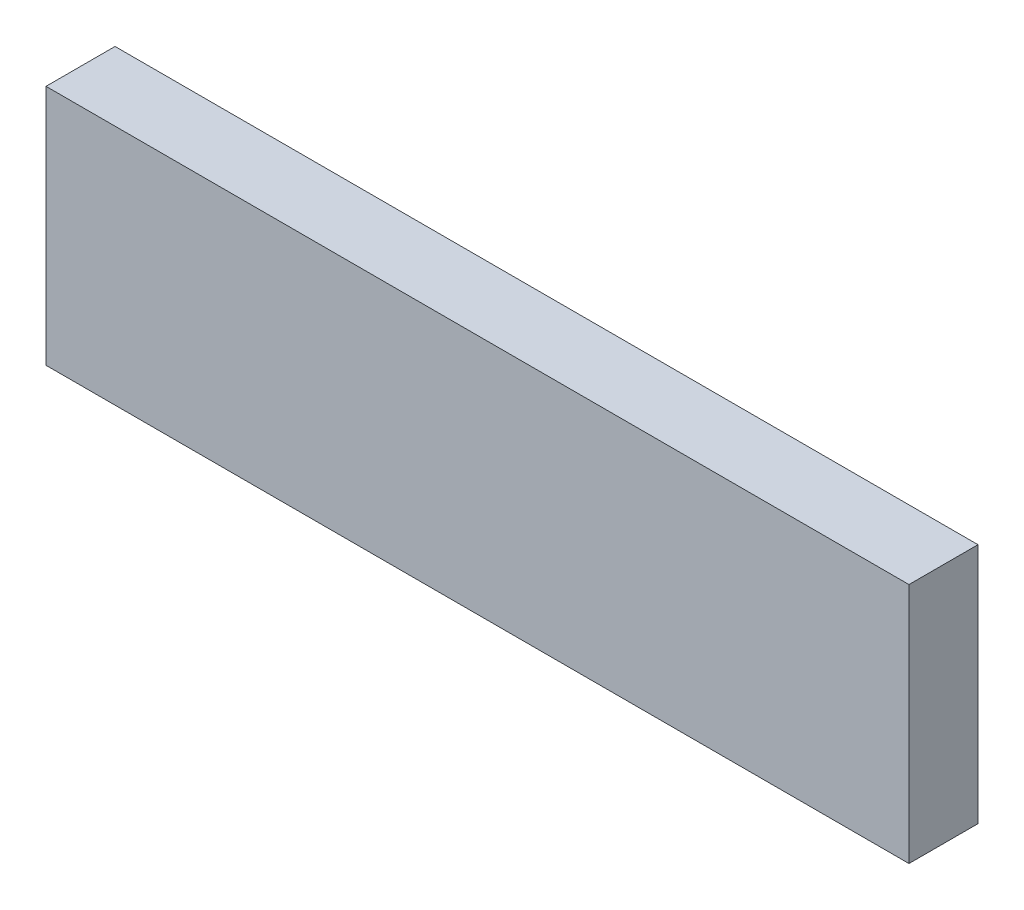
ISO-10303-21;
HEADER;
FILE_DESCRIPTION(('STEP AP214'),'2;1');
FILE_NAME('part.step','',(''),(''),'','','');
FILE_SCHEMA(('AUTOMOTIVE_DESIGN { 1 0 10303 214 1 1 1 1 }'));
ENDSEC;
DATA;
#1=APPLICATION_CONTEXT('core data for automotive mechanical design processes');
#2=APPLICATION_PROTOCOL_DEFINITION('international standard','automotive_design',2000,#1);
#3=PRODUCT_CONTEXT('',#1,'mechanical');
#4=PRODUCT('Part','Part','',(#3));
#5=PRODUCT_RELATED_PRODUCT_CATEGORY('part','',(#4));
#6=PRODUCT_DEFINITION_FORMATION('','',#4);
#7=PRODUCT_DEFINITION_CONTEXT('part definition',#1,'design');
#8=PRODUCT_DEFINITION('design','',#6,#7);
#9=PRODUCT_DEFINITION_SHAPE('','',#8);
#10=(LENGTH_UNIT() NAMED_UNIT(*) SI_UNIT(.MILLI.,.METRE.));
#11=(NAMED_UNIT(*) PLANE_ANGLE_UNIT() SI_UNIT($,.RADIAN.));
#12=(NAMED_UNIT(*) SI_UNIT($,.STERADIAN.) SOLID_ANGLE_UNIT());
#13=UNCERTAINTY_MEASURE_WITH_UNIT(LENGTH_MEASURE(1.E-05),#10,'distance_accuracy_value','');
#14=(GEOMETRIC_REPRESENTATION_CONTEXT(3) GLOBAL_UNCERTAINTY_ASSIGNED_CONTEXT((#13)) GLOBAL_UNIT_ASSIGNED_CONTEXT((#10,
#11,#12)) REPRESENTATION_CONTEXT('',''));
#15=CARTESIAN_POINT('',(0.,0.,0.));
#16=DIRECTION('',(0.,0.,1.));
#17=DIRECTION('',(1.,0.,0.));
#18=AXIS2_PLACEMENT_3D('',#15,#16,#17);
#19=CARTESIAN_POINT('',(125.,-35.,20.));
#20=DIRECTION('',(-1.,0.,0.));
#21=DIRECTION('',(0.,0.,1.));
#22=AXIS2_PLACEMENT_3D('',#19,#20,#21);
#23=PLANE('',#22);
#24=DIRECTION('',(0.,1.,0.));
#25=VECTOR('',#24,1.);
#26=CARTESIAN_POINT('',(125.,-35.,0.));
#27=LINE('',#26,#25);
#28=CARTESIAN_POINT('',(125.,-35.,0.));
#29=VERTEX_POINT('',#28);
#30=CARTESIAN_POINT('',(125.,35.,0.));
#31=VERTEX_POINT('',#30);
#32=EDGE_CURVE('E113',#29,#31,#27,.T.);
#33=ORIENTED_EDGE('',*,*,#32,.T.);
#34=DIRECTION('',(0.,0.,-1.));
#35=VECTOR('',#34,1.);
#36=CARTESIAN_POINT('',(125.,35.,20.));
#37=LINE('',#36,#35);
#38=CARTESIAN_POINT('',(125.,35.,20.));
#39=VERTEX_POINT('',#38);
#40=EDGE_CURVE('E11',#39,#31,#37,.T.);
#41=ORIENTED_EDGE('',*,*,#40,.F.);
#42=DIRECTION('',(0.,1.,0.));
#43=VECTOR('',#42,1.);
#44=CARTESIAN_POINT('',(125.,-35.,20.));
#45=LINE('',#44,#43);
#46=CARTESIAN_POINT('',(125.,-35.,20.));
#47=VERTEX_POINT('',#46);
#48=EDGE_CURVE('E97',#47,#39,#45,.T.);
#49=ORIENTED_EDGE('',*,*,#48,.F.);
#50=DIRECTION('',(0.,0.,-1.));
#51=VECTOR('',#50,1.);
#52=CARTESIAN_POINT('',(125.,-35.,20.));
#53=LINE('',#52,#51);
#54=EDGE_CURVE('E109',#47,#29,#53,.T.);
#55=ORIENTED_EDGE('',*,*,#54,.T.);
#56=EDGE_LOOP('',(#33,#41,#49,#55));
#57=FACE_BOUND('',#56,.T.);
#58=ADVANCED_FACE('F45',(#57),#23,.F.);
#59=CARTESIAN_POINT('',(-125.,35.,20.));
#60=DIRECTION('',(0.,-1.,0.));
#61=DIRECTION('',(0.,0.,-1.));
#62=AXIS2_PLACEMENT_3D('',#59,#60,#61);
#63=PLANE('',#62);
#64=DIRECTION('',(-1.,0.,0.));
#65=VECTOR('',#64,1.);
#66=CARTESIAN_POINT('',(-125.,35.,0.));
#67=LINE('',#66,#65);
#68=CARTESIAN_POINT('',(-125.,35.,0.));
#69=VERTEX_POINT('',#68);
#70=EDGE_CURVE('E102',#31,#69,#67,.T.);
#71=ORIENTED_EDGE('',*,*,#70,.T.);
#72=DIRECTION('',(0.,0.,-1.));
#73=VECTOR('',#72,1.);
#74=CARTESIAN_POINT('',(-125.,35.,20.));
#75=LINE('',#74,#73);
#76=CARTESIAN_POINT('',(-125.,35.,20.));
#77=VERTEX_POINT('',#76);
#78=EDGE_CURVE('E54',#77,#69,#75,.T.);
#79=ORIENTED_EDGE('',*,*,#78,.F.);
#80=DIRECTION('',(-1.,0.,0.));
#81=VECTOR('',#80,1.);
#82=CARTESIAN_POINT('',(-125.,35.,20.));
#83=LINE('',#82,#81);
#84=EDGE_CURVE('E92',#39,#77,#83,.T.);
#85=ORIENTED_EDGE('',*,*,#84,.F.);
#86=ORIENTED_EDGE('',*,*,#40,.T.);
#87=EDGE_LOOP('',(#71,#79,#85,#86));
#88=FACE_BOUND('',#87,.T.);
#89=ADVANCED_FACE('F101',(#88),#63,.F.);
#90=CARTESIAN_POINT('',(-125.,-35.,20.));
#91=DIRECTION('',(1.,0.,0.));
#92=DIRECTION('',(0.,0.,-1.));
#93=AXIS2_PLACEMENT_3D('',#90,#91,#92);
#94=PLANE('',#93);
#95=DIRECTION('',(0.,-1.,0.));
#96=VECTOR('',#95,1.);
#97=CARTESIAN_POINT('',(-125.,-35.,0.));
#98=LINE('',#97,#96);
#99=CARTESIAN_POINT('',(-125.,-35.,0.));
#100=VERTEX_POINT('',#99);
#101=EDGE_CURVE('E79',#69,#100,#98,.T.);
#102=ORIENTED_EDGE('',*,*,#101,.T.);
#103=DIRECTION('',(0.,0.,-1.));
#104=VECTOR('',#103,1.);
#105=CARTESIAN_POINT('',(-125.,-35.,20.));
#106=LINE('',#105,#104);
#107=CARTESIAN_POINT('',(-125.,-35.,20.));
#108=VERTEX_POINT('',#107);
#109=EDGE_CURVE('E104',#108,#100,#106,.T.);
#110=ORIENTED_EDGE('',*,*,#109,.F.);
#111=DIRECTION('',(0.,-1.,0.));
#112=VECTOR('',#111,1.);
#113=CARTESIAN_POINT('',(-125.,-35.,20.));
#114=LINE('',#113,#112);
#115=EDGE_CURVE('E95',#77,#108,#114,.T.);
#116=ORIENTED_EDGE('',*,*,#115,.F.);
#117=ORIENTED_EDGE('',*,*,#78,.T.);
#118=EDGE_LOOP('',(#102,#110,#116,#117));
#119=FACE_BOUND('',#118,.T.);
#120=ADVANCED_FACE('F105',(#119),#94,.F.);
#121=CARTESIAN_POINT('',(-125.,-35.,20.));
#122=DIRECTION('',(0.,1.,0.));
#123=DIRECTION('',(0.,0.,1.));
#124=AXIS2_PLACEMENT_3D('',#121,#122,#123);
#125=PLANE('',#124);
#126=DIRECTION('',(1.,0.,0.));
#127=VECTOR('',#126,1.);
#128=CARTESIAN_POINT('',(-125.,-35.,0.));
#129=LINE('',#128,#127);
#130=EDGE_CURVE('E85',#100,#29,#129,.T.);
#131=ORIENTED_EDGE('',*,*,#130,.T.);
#132=ORIENTED_EDGE('',*,*,#54,.F.);
#133=DIRECTION('',(1.,0.,0.));
#134=VECTOR('',#133,1.);
#135=CARTESIAN_POINT('',(-125.,-35.,20.));
#136=LINE('',#135,#134);
#137=EDGE_CURVE('E62',#108,#47,#136,.T.);
#138=ORIENTED_EDGE('',*,*,#137,.F.);
#139=ORIENTED_EDGE('',*,*,#109,.T.);
#140=EDGE_LOOP('',(#131,#132,#138,#139));
#141=FACE_BOUND('',#140,.T.);
#142=ADVANCED_FACE('F126',(#141),#125,.F.);
#143=CARTESIAN_POINT('',(0.,0.,20.));
#144=DIRECTION('',(0.,0.,-1.));
#145=DIRECTION('',(-1.,0.,0.));
#146=AXIS2_PLACEMENT_3D('',#143,#144,#145);
#147=PLANE('',#146);
#148=ORIENTED_EDGE('',*,*,#48,.T.);
#149=ORIENTED_EDGE('',*,*,#84,.T.);
#150=ORIENTED_EDGE('',*,*,#115,.T.);
#151=ORIENTED_EDGE('',*,*,#137,.T.);
#152=EDGE_LOOP('',(#148,#149,#150,#151));
#153=FACE_BOUND('',#152,.T.);
#154=ADVANCED_FACE('F93',(#153),#147,.F.);
#155=CARTESIAN_POINT('',(0.,0.,0.));
#156=DIRECTION('',(0.,0.,-1.));
#157=DIRECTION('',(-1.,0.,0.));
#158=AXIS2_PLACEMENT_3D('',#155,#156,#157);
#159=PLANE('',#158);
#160=ORIENTED_EDGE('',*,*,#32,.F.);
#161=ORIENTED_EDGE('',*,*,#130,.F.);
#162=ORIENTED_EDGE('',*,*,#101,.F.);
#163=ORIENTED_EDGE('',*,*,#70,.F.);
#164=EDGE_LOOP('',(#160,#161,#162,#163));
#165=FACE_BOUND('',#164,.T.);
#166=ADVANCED_FACE('F129',(#165),#159,.T.);
#167=CLOSED_SHELL('',(#58,#89,#120,#142,#154,#166));
#168=MANIFOLD_SOLID_BREP('B2',#167);
#169=ADVANCED_BREP_SHAPE_REPRESENTATION('',(#18,#168),#14);
#170=SHAPE_DEFINITION_REPRESENTATION(#9,#169);
ENDSEC;
END-ISO-10303-21;
